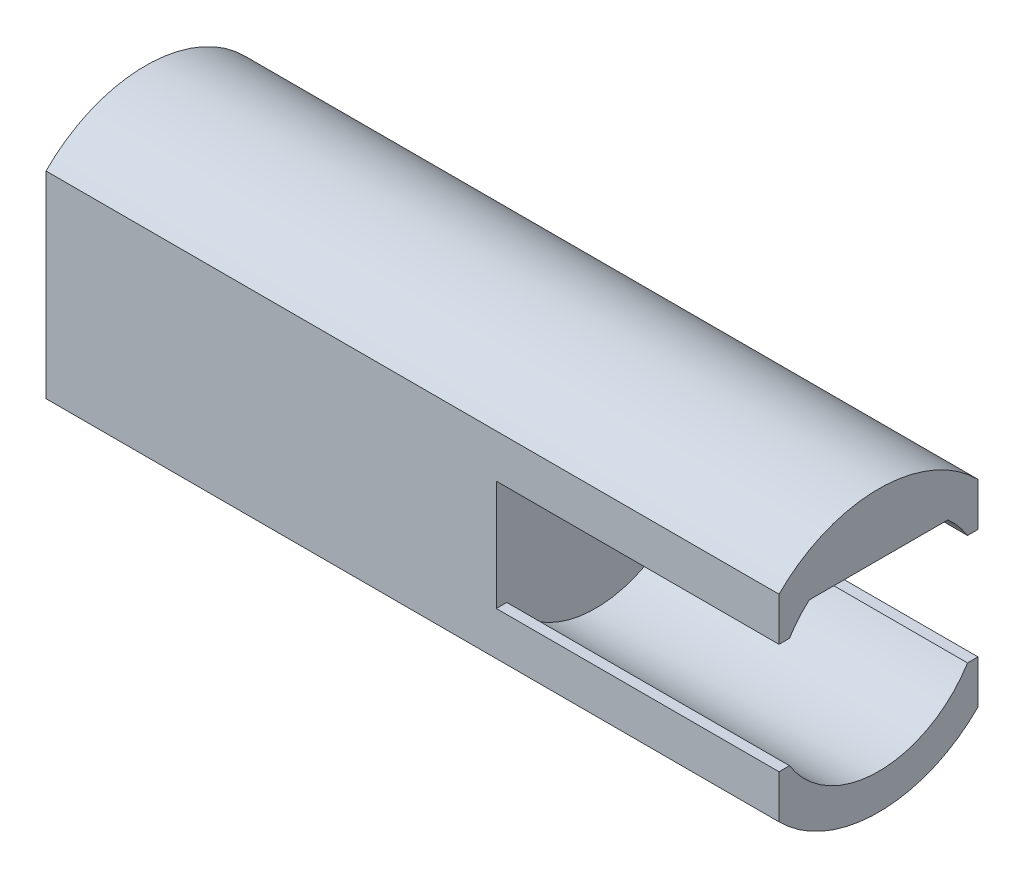
ISO-10303-21;
HEADER;
FILE_DESCRIPTION(('STEP AP214'),'2;1');
FILE_NAME('part.step','',(''),(''),'','','');
FILE_SCHEMA(('AUTOMOTIVE_DESIGN { 1 0 10303 214 1 1 1 1 }'));
ENDSEC;
DATA;
#1=APPLICATION_CONTEXT('core data for automotive mechanical design processes');
#2=APPLICATION_PROTOCOL_DEFINITION('international standard','automotive_design',2000,#1);
#3=PRODUCT_CONTEXT('',#1,'mechanical');
#4=PRODUCT('Part','Part','',(#3));
#5=PRODUCT_RELATED_PRODUCT_CATEGORY('part','',(#4));
#6=PRODUCT_DEFINITION_FORMATION('','',#4);
#7=PRODUCT_DEFINITION_CONTEXT('part definition',#1,'design');
#8=PRODUCT_DEFINITION('design','',#6,#7);
#9=PRODUCT_DEFINITION_SHAPE('','',#8);
#10=(LENGTH_UNIT() NAMED_UNIT(*) SI_UNIT(.MILLI.,.METRE.));
#11=(NAMED_UNIT(*) PLANE_ANGLE_UNIT() SI_UNIT($,.RADIAN.));
#12=(NAMED_UNIT(*) SI_UNIT($,.STERADIAN.) SOLID_ANGLE_UNIT());
#13=UNCERTAINTY_MEASURE_WITH_UNIT(LENGTH_MEASURE(1.E-05),#10,'distance_accuracy_value','');
#14=(GEOMETRIC_REPRESENTATION_CONTEXT(3) GLOBAL_UNCERTAINTY_ASSIGNED_CONTEXT((#13)) GLOBAL_UNIT_ASSIGNED_CONTEXT((#10,
#11,#12)) REPRESENTATION_CONTEXT('',''));
#15=CARTESIAN_POINT('',(0.,0.,0.));
#16=DIRECTION('',(0.,0.,1.));
#17=DIRECTION('',(1.,0.,0.));
#18=AXIS2_PLACEMENT_3D('',#15,#16,#17);
#19=CARTESIAN_POINT('',(0.,0.,0.));
#20=DIRECTION('',(-1.,0.,0.));
#21=DIRECTION('',(0.,0.,1.));
#22=AXIS2_PLACEMENT_3D('',#19,#20,#21);
#23=PLANE('',#22);
#24=DIRECTION('',(0.,0.,1.));
#25=VECTOR('',#24,1.);
#26=CARTESIAN_POINT('',(0.,-1.05356537528527,-1.7));
#27=LINE('',#26,#25);
#28=CARTESIAN_POINT('',(0.,-1.05356537528527,-1.9));
#29=VERTEX_POINT('',#28);
#30=CARTESIAN_POINT('',(0.,-1.05356537528527,-1.7));
#31=VERTEX_POINT('',#30);
#32=EDGE_CURVE('E168',#29,#31,#27,.T.);
#33=ORIENTED_EDGE('',*,*,#32,.F.);
#34=DIRECTION('',(0.,-1.,0.));
#35=VECTOR('',#34,1.);
#36=CARTESIAN_POINT('',(0.,1.88298300576505,-1.9));
#37=LINE('',#36,#35);
#38=CARTESIAN_POINT('',(0.,1.05356537528527,-1.9));
#39=VERTEX_POINT('',#38);
#40=EDGE_CURVE('E140',#39,#29,#37,.T.);
#41=ORIENTED_EDGE('',*,*,#40,.F.);
#42=DIRECTION('',(0.,0.,-1.));
#43=VECTOR('',#42,1.);
#44=CARTESIAN_POINT('',(0.,1.05356537528527,-1.7));
#45=LINE('',#44,#43);
#46=CARTESIAN_POINT('',(0.,1.05356537528527,-1.7));
#47=VERTEX_POINT('',#46);
#48=EDGE_CURVE('E197',#47,#39,#45,.T.);
#49=ORIENTED_EDGE('',*,*,#48,.F.);
#50=CARTESIAN_POINT('',(0.,0.,0.));
#51=DIRECTION('',(-1.,0.,0.));
#52=DIRECTION('',(0.,0.,-1.));
#53=AXIS2_PLACEMENT_3D('',#50,#51,#52);
#54=CIRCLE('',#53,2.);
#55=CARTESIAN_POINT('',(0.,1.5,-1.3228756555323));
#56=VERTEX_POINT('',#55);
#57=EDGE_CURVE('E219',#56,#47,#54,.T.);
#58=ORIENTED_EDGE('',*,*,#57,.F.);
#59=DIRECTION('',(0.,0.,-1.));
#60=VECTOR('',#59,1.);
#61=CARTESIAN_POINT('',(0.,1.5,1.3228756555323));
#62=LINE('',#61,#60);
#63=CARTESIAN_POINT('',(0.,1.5,1.3228756555323));
#64=VERTEX_POINT('',#63);
#65=EDGE_CURVE('E216',#64,#56,#62,.T.);
#66=ORIENTED_EDGE('',*,*,#65,.F.);
#67=CARTESIAN_POINT('',(0.,0.,0.));
#68=DIRECTION('',(-1.,0.,0.));
#69=DIRECTION('',(0.,0.,-1.));
#70=AXIS2_PLACEMENT_3D('',#67,#68,#69);
#71=CIRCLE('',#70,2.);
#72=CARTESIAN_POINT('',(0.,1.05356537528527,1.7));
#73=VERTEX_POINT('',#72);
#74=EDGE_CURVE('E213',#73,#64,#71,.T.);
#75=ORIENTED_EDGE('',*,*,#74,.F.);
#76=DIRECTION('',(0.,0.,-1.));
#77=VECTOR('',#76,1.);
#78=CARTESIAN_POINT('',(0.,1.05356537528527,1.9));
#79=LINE('',#78,#77);
#80=CARTESIAN_POINT('',(0.,1.05356537528527,1.9));
#81=VERTEX_POINT('',#80);
#82=EDGE_CURVE('E189',#81,#73,#79,.T.);
#83=ORIENTED_EDGE('',*,*,#82,.F.);
#84=DIRECTION('',(0.,1.,0.));
#85=VECTOR('',#84,1.);
#86=CARTESIAN_POINT('',(0.,-1.88298300576505,1.9));
#87=LINE('',#86,#85);
#88=CARTESIAN_POINT('',(0.,-1.05356537528527,1.9));
#89=VERTEX_POINT('',#88);
#90=EDGE_CURVE('E180',#89,#81,#87,.T.);
#91=ORIENTED_EDGE('',*,*,#90,.F.);
#92=DIRECTION('',(0.,0.,1.));
#93=VECTOR('',#92,1.);
#94=CARTESIAN_POINT('',(0.,-1.05356537528527,1.9));
#95=LINE('',#94,#93);
#96=CARTESIAN_POINT('',(0.,-1.05356537528527,1.7));
#97=VERTEX_POINT('',#96);
#98=EDGE_CURVE('E156',#97,#89,#95,.T.);
#99=ORIENTED_EDGE('',*,*,#98,.F.);
#100=CARTESIAN_POINT('',(0.,0.,0.));
#101=DIRECTION('',(-1.,0.,0.));
#102=DIRECTION('',(0.,0.,-1.));
#103=AXIS2_PLACEMENT_3D('',#100,#101,#102);
#104=CIRCLE('',#103,2.);
#105=EDGE_CURVE('E158',#31,#97,#104,.T.);
#106=ORIENTED_EDGE('',*,*,#105,.F.);
#107=EDGE_LOOP('',(#33,#41,#49,#58,#66,#75,#83,#91,#99,#106));
#108=FACE_BOUND('',#107,.T.);
#109=ADVANCED_FACE('F33',(#108),#23,.F.);
#110=CARTESIAN_POINT('',(5.4,0.,0.));
#111=DIRECTION('',(-1.,0.,0.));
#112=DIRECTION('',(0.,0.,1.));
#113=AXIS2_PLACEMENT_3D('',#110,#111,#112);
#114=CYLINDRICAL_SURFACE('',#113,2.675);
#115=DIRECTION('',(-1.,0.,0.));
#116=VECTOR('',#115,1.);
#117=CARTESIAN_POINT('',(5.4,1.88298300576505,-1.9));
#118=LINE('',#117,#116);
#119=CARTESIAN_POINT('',(5.4,1.88298300576505,-1.9));
#120=VERTEX_POINT('',#119);
#121=CARTESIAN_POINT('',(-8.6,1.88298300576505,-1.9));
#122=VERTEX_POINT('',#121);
#123=EDGE_CURVE('E210',#120,#122,#118,.T.);
#124=ORIENTED_EDGE('',*,*,#123,.T.);
#125=CARTESIAN_POINT('',(-8.6,0.,0.));
#126=DIRECTION('',(1.,0.,0.));
#127=DIRECTION('',(0.,0.,-1.));
#128=AXIS2_PLACEMENT_3D('',#125,#126,#127);
#129=CIRCLE('',#128,2.675);
#130=CARTESIAN_POINT('',(-8.6,1.88298300576505,1.9));
#131=VERTEX_POINT('',#130);
#132=EDGE_CURVE('E181',#122,#131,#129,.T.);
#133=ORIENTED_EDGE('',*,*,#132,.T.);
#134=DIRECTION('',(-1.,0.,0.));
#135=VECTOR('',#134,1.);
#136=CARTESIAN_POINT('',(5.4,1.88298300576505,1.9));
#137=LINE('',#136,#135);
#138=CARTESIAN_POINT('',(5.4,1.88298300576505,1.9));
#139=VERTEX_POINT('',#138);
#140=EDGE_CURVE('E11',#139,#131,#137,.T.);
#141=ORIENTED_EDGE('',*,*,#140,.F.);
#142=CARTESIAN_POINT('',(5.4,0.,0.));
#143=DIRECTION('',(1.,0.,0.));
#144=DIRECTION('',(0.,0.,1.));
#145=AXIS2_PLACEMENT_3D('',#142,#143,#144);
#146=CIRCLE('',#145,2.675);
#147=EDGE_CURVE('E194',#120,#139,#146,.T.);
#148=ORIENTED_EDGE('',*,*,#147,.F.);
#149=EDGE_LOOP('',(#124,#133,#141,#148));
#150=FACE_BOUND('',#149,.T.);
#151=ADVANCED_FACE('F35',(#150),#114,.T.);
#152=CARTESIAN_POINT('',(5.4,1.88298300576505,1.9));
#153=DIRECTION('',(0.,0.,-1.));
#154=DIRECTION('',(-1.,0.,0.));
#155=AXIS2_PLACEMENT_3D('',#152,#153,#154);
#156=PLANE('',#155);
#157=ORIENTED_EDGE('',*,*,#140,.T.);
#158=DIRECTION('',(0.,-1.,0.));
#159=VECTOR('',#158,1.);
#160=CARTESIAN_POINT('',(-8.6,-1.88298300576505,1.9));
#161=LINE('',#160,#159);
#162=CARTESIAN_POINT('',(-8.6,-1.88298300576505,1.9));
#163=VERTEX_POINT('',#162);
#164=EDGE_CURVE('E184',#131,#163,#161,.T.);
#165=ORIENTED_EDGE('',*,*,#164,.T.);
#166=DIRECTION('',(1.,0.,0.));
#167=VECTOR('',#166,1.);
#168=CARTESIAN_POINT('',(-15.1622023742033,-1.88298300576505,1.9));
#169=LINE('',#168,#167);
#170=CARTESIAN_POINT('',(5.4,-1.88298300576505,1.9));
#171=VERTEX_POINT('',#170);
#172=EDGE_CURVE('E139',#163,#171,#169,.T.);
#173=ORIENTED_EDGE('',*,*,#172,.T.);
#174=DIRECTION('',(0.,-1.,0.));
#175=VECTOR('',#174,1.);
#176=CARTESIAN_POINT('',(5.4,-1.88298300576505,1.9));
#177=LINE('',#176,#175);
#178=CARTESIAN_POINT('',(5.4,-1.05356537528527,1.9));
#179=VERTEX_POINT('',#178);
#180=EDGE_CURVE('E155',#179,#171,#177,.T.);
#181=ORIENTED_EDGE('',*,*,#180,.F.);
#182=DIRECTION('',(-1.,0.,0.));
#183=VECTOR('',#182,1.);
#184=CARTESIAN_POINT('',(5.4,-1.05356537528527,1.9));
#185=LINE('',#184,#183);
#186=EDGE_CURVE('E167',#179,#89,#185,.T.);
#187=ORIENTED_EDGE('',*,*,#186,.T.);
#188=ORIENTED_EDGE('',*,*,#90,.T.);
#189=DIRECTION('',(-1.,0.,0.));
#190=VECTOR('',#189,1.);
#191=CARTESIAN_POINT('',(5.4,1.05356537528527,1.9));
#192=LINE('',#191,#190);
#193=CARTESIAN_POINT('',(5.4,1.05356537528527,1.9));
#194=VERTEX_POINT('',#193);
#195=EDGE_CURVE('E42',#194,#81,#192,.T.);
#196=ORIENTED_EDGE('',*,*,#195,.F.);
#197=DIRECTION('',(0.,-1.,0.));
#198=VECTOR('',#197,1.);
#199=CARTESIAN_POINT('',(5.4,1.88298300576505,1.9));
#200=LINE('',#199,#198);
#201=EDGE_CURVE('E196',#139,#194,#200,.T.);
#202=ORIENTED_EDGE('',*,*,#201,.F.);
#203=EDGE_LOOP('',(#157,#165,#173,#181,#187,#188,#196,#202));
#204=FACE_BOUND('',#203,.T.);
#205=ADVANCED_FACE('F246',(#204),#156,.F.);
#206=CARTESIAN_POINT('',(5.4,1.05356537528527,1.9));
#207=DIRECTION('',(0.,1.,0.));
#208=DIRECTION('',(0.,0.,1.));
#209=AXIS2_PLACEMENT_3D('',#206,#207,#208);
#210=PLANE('',#209);
#211=ORIENTED_EDGE('',*,*,#82,.T.);
#212=DIRECTION('',(-1.,0.,0.));
#213=VECTOR('',#212,1.);
#214=CARTESIAN_POINT('',(5.4,1.05356537528527,1.7));
#215=LINE('',#214,#213);
#216=CARTESIAN_POINT('',(5.4,1.05356537528527,1.7));
#217=VERTEX_POINT('',#216);
#218=EDGE_CURVE('E236',#217,#73,#215,.T.);
#219=ORIENTED_EDGE('',*,*,#218,.F.);
#220=DIRECTION('',(0.,0.,-1.));
#221=VECTOR('',#220,1.);
#222=CARTESIAN_POINT('',(5.4,1.05356537528527,1.9));
#223=LINE('',#222,#221);
#224=EDGE_CURVE('E199',#194,#217,#223,.T.);
#225=ORIENTED_EDGE('',*,*,#224,.F.);
#226=ORIENTED_EDGE('',*,*,#195,.T.);
#227=EDGE_LOOP('',(#211,#219,#225,#226));
#228=FACE_BOUND('',#227,.T.);
#229=ADVANCED_FACE('F242',(#228),#210,.F.);
#230=CARTESIAN_POINT('',(5.4,0.,0.));
#231=DIRECTION('',(-1.,0.,0.));
#232=DIRECTION('',(0.,0.,1.));
#233=AXIS2_PLACEMENT_3D('',#230,#231,#232);
#234=CYLINDRICAL_SURFACE('',#233,2.);
#235=ORIENTED_EDGE('',*,*,#74,.T.);
#236=DIRECTION('',(-1.,0.,0.));
#237=VECTOR('',#236,1.);
#238=CARTESIAN_POINT('',(5.4,1.5,1.3228756555323));
#239=LINE('',#238,#237);
#240=CARTESIAN_POINT('',(5.4,1.5,1.3228756555323));
#241=VERTEX_POINT('',#240);
#242=EDGE_CURVE('E233',#241,#64,#239,.T.);
#243=ORIENTED_EDGE('',*,*,#242,.F.);
#244=CARTESIAN_POINT('',(5.4,0.,0.));
#245=DIRECTION('',(-1.,0.,0.));
#246=DIRECTION('',(0.,0.,-1.));
#247=AXIS2_PLACEMENT_3D('',#244,#245,#246);
#248=CIRCLE('',#247,2.);
#249=EDGE_CURVE('E201',#217,#241,#248,.T.);
#250=ORIENTED_EDGE('',*,*,#249,.F.);
#251=ORIENTED_EDGE('',*,*,#218,.T.);
#252=EDGE_LOOP('',(#235,#243,#250,#251));
#253=FACE_BOUND('',#252,.T.);
#254=ADVANCED_FACE('F255',(#253),#234,.F.);
#255=CARTESIAN_POINT('',(5.4,1.5,1.3228756555323));
#256=DIRECTION('',(0.,1.,0.));
#257=DIRECTION('',(0.,0.,1.));
#258=AXIS2_PLACEMENT_3D('',#255,#256,#257);
#259=PLANE('',#258);
#260=ORIENTED_EDGE('',*,*,#65,.T.);
#261=DIRECTION('',(-1.,0.,0.));
#262=VECTOR('',#261,1.);
#263=CARTESIAN_POINT('',(5.4,1.5,-1.3228756555323));
#264=LINE('',#263,#262);
#265=CARTESIAN_POINT('',(5.4,1.5,-1.3228756555323));
#266=VERTEX_POINT('',#265);
#267=EDGE_CURVE('E230',#266,#56,#264,.T.);
#268=ORIENTED_EDGE('',*,*,#267,.F.);
#269=DIRECTION('',(0.,0.,-1.));
#270=VECTOR('',#269,1.);
#271=CARTESIAN_POINT('',(5.4,1.5,1.3228756555323));
#272=LINE('',#271,#270);
#273=EDGE_CURVE('E203',#241,#266,#272,.T.);
#274=ORIENTED_EDGE('',*,*,#273,.F.);
#275=ORIENTED_EDGE('',*,*,#242,.T.);
#276=EDGE_LOOP('',(#260,#268,#274,#275));
#277=FACE_BOUND('',#276,.T.);
#278=ADVANCED_FACE('F259',(#277),#259,.F.);
#279=CARTESIAN_POINT('',(5.4,0.,0.));
#280=DIRECTION('',(-1.,0.,0.));
#281=DIRECTION('',(0.,0.,1.));
#282=AXIS2_PLACEMENT_3D('',#279,#280,#281);
#283=CYLINDRICAL_SURFACE('',#282,2.);
#284=ORIENTED_EDGE('',*,*,#57,.T.);
#285=DIRECTION('',(-1.,0.,0.));
#286=VECTOR('',#285,1.);
#287=CARTESIAN_POINT('',(5.4,1.05356537528527,-1.7));
#288=LINE('',#287,#286);
#289=CARTESIAN_POINT('',(5.4,1.05356537528527,-1.7));
#290=VERTEX_POINT('',#289);
#291=EDGE_CURVE('E227',#290,#47,#288,.T.);
#292=ORIENTED_EDGE('',*,*,#291,.F.);
#293=CARTESIAN_POINT('',(5.4,0.,0.));
#294=DIRECTION('',(-1.,0.,0.));
#295=DIRECTION('',(0.,0.,-1.));
#296=AXIS2_PLACEMENT_3D('',#293,#294,#295);
#297=CIRCLE('',#296,2.);
#298=EDGE_CURVE('E205',#266,#290,#297,.T.);
#299=ORIENTED_EDGE('',*,*,#298,.F.);
#300=ORIENTED_EDGE('',*,*,#267,.T.);
#301=EDGE_LOOP('',(#284,#292,#299,#300));
#302=FACE_BOUND('',#301,.T.);
#303=ADVANCED_FACE('F276',(#302),#283,.F.);
#304=CARTESIAN_POINT('',(5.4,1.05356537528527,-1.7));
#305=DIRECTION('',(0.,1.,0.));
#306=DIRECTION('',(0.,0.,1.));
#307=AXIS2_PLACEMENT_3D('',#304,#305,#306);
#308=PLANE('',#307);
#309=ORIENTED_EDGE('',*,*,#48,.T.);
#310=DIRECTION('',(-1.,0.,0.));
#311=VECTOR('',#310,1.);
#312=CARTESIAN_POINT('',(5.4,1.05356537528527,-1.9));
#313=LINE('',#312,#311);
#314=CARTESIAN_POINT('',(5.4,1.05356537528527,-1.9));
#315=VERTEX_POINT('',#314);
#316=EDGE_CURVE('E225',#315,#39,#313,.T.);
#317=ORIENTED_EDGE('',*,*,#316,.F.);
#318=DIRECTION('',(0.,0.,-1.));
#319=VECTOR('',#318,1.);
#320=CARTESIAN_POINT('',(5.4,1.05356537528527,-1.7));
#321=LINE('',#320,#319);
#322=EDGE_CURVE('E207',#290,#315,#321,.T.);
#323=ORIENTED_EDGE('',*,*,#322,.F.);
#324=ORIENTED_EDGE('',*,*,#291,.T.);
#325=EDGE_LOOP('',(#309,#317,#323,#324));
#326=FACE_BOUND('',#325,.T.);
#327=ADVANCED_FACE('F274',(#326),#308,.F.);
#328=CARTESIAN_POINT('',(5.4,1.88298300576505,-1.9));
#329=DIRECTION('',(0.,0.,1.));
#330=DIRECTION('',(1.,0.,0.));
#331=AXIS2_PLACEMENT_3D('',#328,#329,#330);
#332=PLANE('',#331);
#333=ORIENTED_EDGE('',*,*,#316,.T.);
#334=ORIENTED_EDGE('',*,*,#40,.T.);
#335=DIRECTION('',(-1.,0.,0.));
#336=VECTOR('',#335,1.);
#337=CARTESIAN_POINT('',(5.4,-1.05356537528527,-1.9));
#338=LINE('',#337,#336);
#339=CARTESIAN_POINT('',(5.4,-1.05356537528527,-1.9));
#340=VERTEX_POINT('',#339);
#341=EDGE_CURVE('E147',#340,#29,#338,.T.);
#342=ORIENTED_EDGE('',*,*,#341,.F.);
#343=DIRECTION('',(0.,1.,0.));
#344=VECTOR('',#343,1.);
#345=CARTESIAN_POINT('',(5.4,-1.88298300576505,-1.9));
#346=LINE('',#345,#344);
#347=CARTESIAN_POINT('',(5.4,-1.88298300576505,-1.9));
#348=VERTEX_POINT('',#347);
#349=EDGE_CURVE('E143',#348,#340,#346,.T.);
#350=ORIENTED_EDGE('',*,*,#349,.F.);
#351=DIRECTION('',(1.,0.,0.));
#352=VECTOR('',#351,1.);
#353=CARTESIAN_POINT('',(-15.1622023742033,-1.88298300576505,-1.9));
#354=LINE('',#353,#352);
#355=CARTESIAN_POINT('',(-8.6,-1.88298300576505,-1.9));
#356=VERTEX_POINT('',#355);
#357=EDGE_CURVE('E130',#356,#348,#354,.T.);
#358=ORIENTED_EDGE('',*,*,#357,.F.);
#359=DIRECTION('',(0.,1.,0.));
#360=VECTOR('',#359,1.);
#361=CARTESIAN_POINT('',(-8.6,1.88298300576505,-1.9));
#362=LINE('',#361,#360);
#363=EDGE_CURVE('E185',#356,#122,#362,.T.);
#364=ORIENTED_EDGE('',*,*,#363,.T.);
#365=ORIENTED_EDGE('',*,*,#123,.F.);
#366=DIRECTION('',(0.,1.,0.));
#367=VECTOR('',#366,1.);
#368=CARTESIAN_POINT('',(5.4,1.88298300576505,-1.9));
#369=LINE('',#368,#367);
#370=EDGE_CURVE('E49',#315,#120,#369,.T.);
#371=ORIENTED_EDGE('',*,*,#370,.F.);
#372=EDGE_LOOP('',(#333,#334,#342,#350,#358,#364,#365,#371));
#373=FACE_BOUND('',#372,.T.);
#374=ADVANCED_FACE('F145',(#373),#332,.F.);
#375=CARTESIAN_POINT('',(5.4,0.,0.));
#376=DIRECTION('',(-1.,0.,0.));
#377=DIRECTION('',(0.,0.,1.));
#378=AXIS2_PLACEMENT_3D('',#375,#376,#377);
#379=PLANE('',#378);
#380=ORIENTED_EDGE('',*,*,#147,.T.);
#381=ORIENTED_EDGE('',*,*,#201,.T.);
#382=ORIENTED_EDGE('',*,*,#224,.T.);
#383=ORIENTED_EDGE('',*,*,#249,.T.);
#384=ORIENTED_EDGE('',*,*,#273,.T.);
#385=ORIENTED_EDGE('',*,*,#298,.T.);
#386=ORIENTED_EDGE('',*,*,#322,.T.);
#387=ORIENTED_EDGE('',*,*,#370,.T.);
#388=EDGE_LOOP('',(#380,#381,#382,#383,#384,#385,#386,#387));
#389=FACE_BOUND('',#388,.T.);
#390=ADVANCED_FACE('F262',(#389),#379,.F.);
#391=CARTESIAN_POINT('',(-15.1622023742033,0.,0.));
#392=DIRECTION('',(1.,0.,0.));
#393=DIRECTION('',(0.,0.,-1.));
#394=AXIS2_PLACEMENT_3D('',#391,#392,#393);
#395=CYLINDRICAL_SURFACE('',#394,2.675);
#396=ORIENTED_EDGE('',*,*,#172,.F.);
#397=CARTESIAN_POINT('',(-8.6,0.,0.));
#398=DIRECTION('',(1.,0.,0.));
#399=DIRECTION('',(0.,0.,-1.));
#400=AXIS2_PLACEMENT_3D('',#397,#398,#399);
#401=CIRCLE('',#400,2.675);
#402=EDGE_CURVE('E136',#163,#356,#401,.T.);
#403=ORIENTED_EDGE('',*,*,#402,.T.);
#404=ORIENTED_EDGE('',*,*,#357,.T.);
#405=CARTESIAN_POINT('',(5.4,0.,0.));
#406=DIRECTION('',(1.,0.,0.));
#407=DIRECTION('',(0.,0.,-1.));
#408=AXIS2_PLACEMENT_3D('',#405,#406,#407);
#409=CIRCLE('',#408,2.675);
#410=EDGE_CURVE('E135',#171,#348,#409,.T.);
#411=ORIENTED_EDGE('',*,*,#410,.F.);
#412=EDGE_LOOP('',(#396,#403,#404,#411));
#413=FACE_BOUND('',#412,.T.);
#414=ADVANCED_FACE('F133',(#413),#395,.T.);
#415=CARTESIAN_POINT('',(-8.6,0.,0.));
#416=DIRECTION('',(1.,0.,0.));
#417=DIRECTION('',(0.,0.,-1.));
#418=AXIS2_PLACEMENT_3D('',#415,#416,#417);
#419=PLANE('',#418);
#420=ORIENTED_EDGE('',*,*,#164,.F.);
#421=ORIENTED_EDGE('',*,*,#132,.F.);
#422=ORIENTED_EDGE('',*,*,#363,.F.);
#423=ORIENTED_EDGE('',*,*,#402,.F.);
#424=EDGE_LOOP('',(#420,#421,#422,#423));
#425=FACE_BOUND('',#424,.T.);
#426=ADVANCED_FACE('F270',(#425),#419,.F.);
#427=CARTESIAN_POINT('',(5.4,-1.05356537528527,-1.7));
#428=DIRECTION('',(0.,-1.,0.));
#429=DIRECTION('',(0.,0.,-1.));
#430=AXIS2_PLACEMENT_3D('',#427,#428,#429);
#431=PLANE('',#430);
#432=ORIENTED_EDGE('',*,*,#32,.T.);
#433=DIRECTION('',(-1.,0.,0.));
#434=VECTOR('',#433,1.);
#435=CARTESIAN_POINT('',(5.4,-1.05356537528527,-1.7));
#436=LINE('',#435,#434);
#437=CARTESIAN_POINT('',(5.4,-1.05356537528527,-1.7));
#438=VERTEX_POINT('',#437);
#439=EDGE_CURVE('E176',#438,#31,#436,.T.);
#440=ORIENTED_EDGE('',*,*,#439,.F.);
#441=DIRECTION('',(0.,0.,1.));
#442=VECTOR('',#441,1.);
#443=CARTESIAN_POINT('',(5.4,-1.05356537528527,-1.7));
#444=LINE('',#443,#442);
#445=EDGE_CURVE('E150',#340,#438,#444,.T.);
#446=ORIENTED_EDGE('',*,*,#445,.F.);
#447=ORIENTED_EDGE('',*,*,#341,.T.);
#448=EDGE_LOOP('',(#432,#440,#446,#447));
#449=FACE_BOUND('',#448,.T.);
#450=ADVANCED_FACE('F316',(#449),#431,.F.);
#451=CARTESIAN_POINT('',(5.4,0.,0.));
#452=DIRECTION('',(-1.,0.,0.));
#453=DIRECTION('',(0.,0.,1.));
#454=AXIS2_PLACEMENT_3D('',#451,#452,#453);
#455=CYLINDRICAL_SURFACE('',#454,2.);
#456=ORIENTED_EDGE('',*,*,#105,.T.);
#457=DIRECTION('',(-1.,0.,0.));
#458=VECTOR('',#457,1.);
#459=CARTESIAN_POINT('',(5.4,-1.05356537528527,1.7));
#460=LINE('',#459,#458);
#461=CARTESIAN_POINT('',(5.4,-1.05356537528527,1.7));
#462=VERTEX_POINT('',#461);
#463=EDGE_CURVE('E173',#462,#97,#460,.T.);
#464=ORIENTED_EDGE('',*,*,#463,.F.);
#465=CARTESIAN_POINT('',(5.4,0.,0.));
#466=DIRECTION('',(-1.,0.,0.));
#467=DIRECTION('',(0.,0.,-1.));
#468=AXIS2_PLACEMENT_3D('',#465,#466,#467);
#469=CIRCLE('',#468,2.);
#470=EDGE_CURVE('E162',#438,#462,#469,.T.);
#471=ORIENTED_EDGE('',*,*,#470,.F.);
#472=ORIENTED_EDGE('',*,*,#439,.T.);
#473=EDGE_LOOP('',(#456,#464,#471,#472));
#474=FACE_BOUND('',#473,.T.);
#475=ADVANCED_FACE('F322',(#474),#455,.F.);
#476=CARTESIAN_POINT('',(5.4,-1.05356537528527,1.9));
#477=DIRECTION('',(0.,-1.,0.));
#478=DIRECTION('',(0.,0.,-1.));
#479=AXIS2_PLACEMENT_3D('',#476,#477,#478);
#480=PLANE('',#479);
#481=ORIENTED_EDGE('',*,*,#98,.T.);
#482=ORIENTED_EDGE('',*,*,#186,.F.);
#483=DIRECTION('',(0.,0.,1.));
#484=VECTOR('',#483,1.);
#485=CARTESIAN_POINT('',(5.4,-1.05356537528527,1.9));
#486=LINE('',#485,#484);
#487=EDGE_CURVE('E164',#462,#179,#486,.T.);
#488=ORIENTED_EDGE('',*,*,#487,.F.);
#489=ORIENTED_EDGE('',*,*,#463,.T.);
#490=EDGE_LOOP('',(#481,#482,#488,#489));
#491=FACE_BOUND('',#490,.T.);
#492=ADVANCED_FACE('F329',(#491),#480,.F.);
#493=CARTESIAN_POINT('',(5.4,0.,0.));
#494=DIRECTION('',(1.,0.,0.));
#495=DIRECTION('',(0.,0.,-1.));
#496=AXIS2_PLACEMENT_3D('',#493,#494,#495);
#497=PLANE('',#496);
#498=ORIENTED_EDGE('',*,*,#410,.T.);
#499=ORIENTED_EDGE('',*,*,#349,.T.);
#500=ORIENTED_EDGE('',*,*,#445,.T.);
#501=ORIENTED_EDGE('',*,*,#470,.T.);
#502=ORIENTED_EDGE('',*,*,#487,.T.);
#503=ORIENTED_EDGE('',*,*,#180,.T.);
#504=EDGE_LOOP('',(#498,#499,#500,#501,#502,#503));
#505=FACE_BOUND('',#504,.T.);
#506=ADVANCED_FACE('F153',(#505),#497,.T.);
#507=CLOSED_SHELL('',(#109,#151,#205,#229,#254,#278,#303,#327,#374,#390,#414,#426,#450,#475,
#492,#506));
#508=MANIFOLD_SOLID_BREP('B2',#507);
#509=ADVANCED_BREP_SHAPE_REPRESENTATION('',(#18,#508),#14);
#510=SHAPE_DEFINITION_REPRESENTATION(#9,#509);
ENDSEC;
END-ISO-10303-21;
